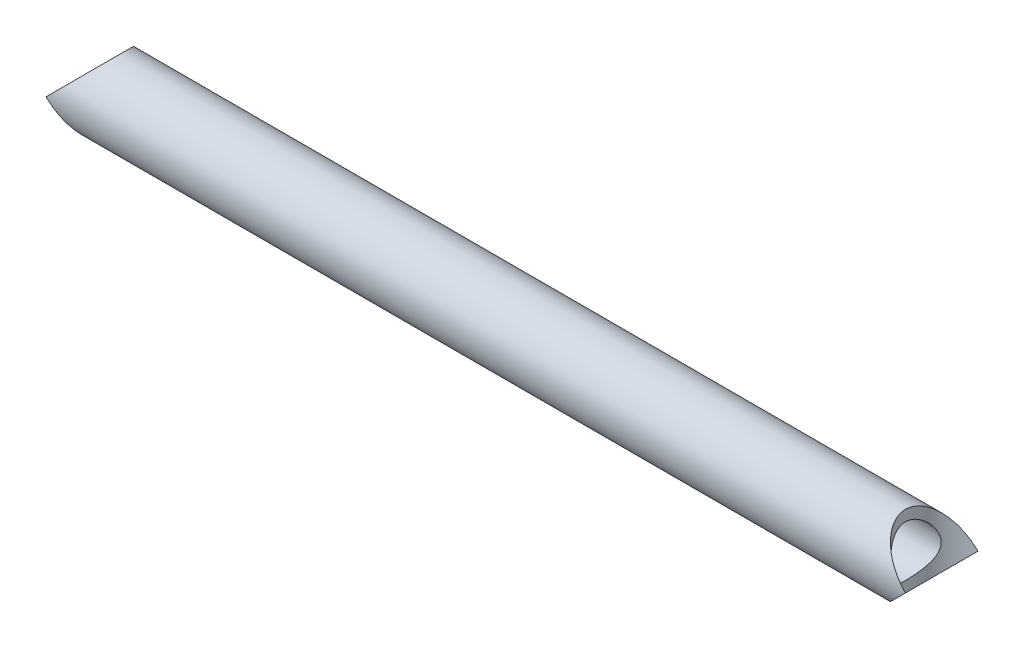
ISO-10303-21;
HEADER;
FILE_DESCRIPTION(('STEP AP214'),'2;1');
FILE_NAME('part.step','',(''),(''),'','','');
FILE_SCHEMA(('AUTOMOTIVE_DESIGN { 1 0 10303 214 1 1 1 1 }'));
ENDSEC;
DATA;
#1=APPLICATION_CONTEXT('core data for automotive mechanical design processes');
#2=APPLICATION_PROTOCOL_DEFINITION('international standard','automotive_design',2000,#1);
#3=PRODUCT_CONTEXT('',#1,'mechanical');
#4=PRODUCT('Part','Part','',(#3));
#5=PRODUCT_RELATED_PRODUCT_CATEGORY('part','',(#4));
#6=PRODUCT_DEFINITION_FORMATION('','',#4);
#7=PRODUCT_DEFINITION_CONTEXT('part definition',#1,'design');
#8=PRODUCT_DEFINITION('design','',#6,#7);
#9=PRODUCT_DEFINITION_SHAPE('','',#8);
#10=(LENGTH_UNIT() NAMED_UNIT(*) SI_UNIT(.MILLI.,.METRE.));
#11=(NAMED_UNIT(*) PLANE_ANGLE_UNIT() SI_UNIT($,.RADIAN.));
#12=(NAMED_UNIT(*) SI_UNIT($,.STERADIAN.) SOLID_ANGLE_UNIT());
#13=UNCERTAINTY_MEASURE_WITH_UNIT(LENGTH_MEASURE(1.E-05),#10,'distance_accuracy_value','');
#14=(GEOMETRIC_REPRESENTATION_CONTEXT(3) GLOBAL_UNCERTAINTY_ASSIGNED_CONTEXT((#13)) GLOBAL_UNIT_ASSIGNED_CONTEXT((#10,
#11,#12)) REPRESENTATION_CONTEXT('',''));
#15=CARTESIAN_POINT('',(0.,0.,0.));
#16=DIRECTION('',(0.,0.,1.));
#17=DIRECTION('',(1.,0.,0.));
#18=AXIS2_PLACEMENT_3D('',#15,#16,#17);
#19=CARTESIAN_POINT('',(0.,0.,0.));
#20=DIRECTION('',(1.,0.,0.));
#21=DIRECTION('',(0.,0.,-1.));
#22=AXIS2_PLACEMENT_3D('',#19,#20,#21);
#23=CYLINDRICAL_SURFACE('',#22,35.);
#24=CARTESIAN_POINT('',(35.7071421427142,0.,-35.));
#25=CARTESIAN_POINT('',(35.7071506960339,0.840107969640403,-34.999995372535));
#26=CARTESIAN_POINT('',(35.7369348035131,1.68027595587627,-34.9696838888615));
#27=CARTESIAN_POINT('',(35.8544471947958,3.35221612686096,-34.8491819248762));
#28=CARTESIAN_POINT('',(35.9421828399308,4.1839872313608,-34.7589838374224));
#29=CARTESIAN_POINT('',(36.1712293688525,5.83320919168844,-34.5205642195381));
#30=CARTESIAN_POINT('',(36.3126425511041,6.65062956617838,-34.3722318793915));
#31=CARTESIAN_POINT('',(36.6423988735656,8.26372825663241,-34.0204719036504));
#32=CARTESIAN_POINT('',(36.8307439251374,9.0594056856216,-33.8170420241069));
#33=CARTESIAN_POINT('',(37.2443889590487,10.6160962668867,-33.3608911380292));
#34=CARTESIAN_POINT('',(37.4692473366944,11.377399510945,-33.1087530503742));
#35=CARTESIAN_POINT('',(37.9498912115004,12.8722697515329,-32.5567138302996));
#36=CARTESIAN_POINT('',(38.2056760937748,13.6058372991278,-32.2568136474564));
#37=CARTESIAN_POINT('',(38.7410119421266,15.0436443658859,-31.6118578615202));
#38=CARTESIAN_POINT('',(39.020559923923,15.7478875512387,-31.2668079256177));
#39=CARTESIAN_POINT('',(39.5969082877492,17.1262102767459,-30.5336264742114));
#40=CARTESIAN_POINT('',(39.8937099050371,17.8002876510772,-30.1454918722869));
#41=CARTESIAN_POINT('',(40.551609749269,19.2329409336998,-29.2561784374031));
#42=CARTESIAN_POINT('',(40.914864074247,19.985636533046,-28.7471070972688));
#43=CARTESIAN_POINT('',(41.6482789820097,21.4471112794062,-27.6738766652288));
#44=CARTESIAN_POINT('',(42.0184400774716,22.1558871493288,-27.1097134706892));
#45=CARTESIAN_POINT('',(42.7582340933028,23.5287326231606,-25.9272125065644));
#46=CARTESIAN_POINT('',(43.127865884777,24.1927488103879,-25.3088119653039));
#47=CARTESIAN_POINT('',(43.8588504301021,25.4730222520025,-24.0197921583749));
#48=CARTESIAN_POINT('',(44.2202026109753,26.0892762080667,-23.3491692927814));
#49=CARTESIAN_POINT('',(44.9867285846432,27.3698937944522,-21.8408769297574));
#50=CARTESIAN_POINT('',(45.389154931207,28.0251298541144,-20.9940046961307));
#51=CARTESIAN_POINT('',(46.1625833914162,29.261175575932,-19.2338365369213));
#52=CARTESIAN_POINT('',(46.5335797092928,29.8419715212443,-18.3205284178719));
#53=CARTESIAN_POINT('',(47.2331338246412,30.9214761037239,-16.432938159996));
#54=CARTESIAN_POINT('',(47.561759750431,31.4203168818842,-15.4587577411312));
#55=CARTESIAN_POINT('',(48.0156533510476,32.1018921667805,-13.9560498011597));
#56=CARTESIAN_POINT('',(48.1604408743064,32.3179655365879,-13.4482527308478));
#57=CARTESIAN_POINT('',(48.4358774539447,32.7270090161536,-12.4197059332497));
#58=CARTESIAN_POINT('',(48.5665277966041,32.9199812279547,-11.8989573896723));
#59=CARTESIAN_POINT('',(48.8692939322469,33.36533512942,-10.6026563492037));
#60=CARTESIAN_POINT('',(49.0327544374962,33.6040865614514,-9.82032326239985));
#61=CARTESIAN_POINT('',(49.3238132945429,34.0273736921218,-8.23474760358175));
#62=CARTESIAN_POINT('',(49.4514179853557,34.2119189742274,-7.43150875500591));
#63=CARTESIAN_POINT('',(49.6680897633444,34.5243655933765,-5.80945738690225));
#64=CARTESIAN_POINT('',(49.7571815736647,34.6523032706249,-4.99065521170869));
#65=CARTESIAN_POINT('',(49.8949954169263,34.8499008596341,-3.3426287169344));
#66=CARTESIAN_POINT('',(49.9437160792339,34.9195587927502,-2.51340404447149));
#67=CARTESIAN_POINT('',(49.9997369695583,34.9996360491842,-0.849064569498375));
#68=CARTESIAN_POINT('',(50.0069561404409,35.0099394464219,-0.0139414278536153));
#69=CARTESIAN_POINT('',(49.9795905662272,34.9708402171738,1.65420898993208));
#70=CARTESIAN_POINT('',(49.9450059780367,34.9214378147871,2.48723627392784));
#71=CARTESIAN_POINT('',(49.8348110399218,34.7636530151837,4.14511747217352));
#72=CARTESIAN_POINT('',(49.7591911431662,34.6552568931089,4.96996943895306));
#73=CARTESIAN_POINT('',(49.5686015156259,34.3810407659299,6.60541848255173));
#74=CARTESIAN_POINT('',(49.4536317547529,34.2152207169174,7.41601554847058));
#75=CARTESIAN_POINT('',(49.1898587017827,33.8328374554661,8.99928619345004));
#76=CARTESIAN_POINT('',(49.0418920994671,33.6175256222774,9.77240316665133));
#77=CARTESIAN_POINT('',(48.7135826943793,33.1367465419105,11.2957516606701));
#78=CARTESIAN_POINT('',(48.5332406093663,32.8712804066381,12.0459836884118));
#79=CARTESIAN_POINT('',(48.1434050941599,32.2929262141351,13.5201301256891));
#80=CARTESIAN_POINT('',(47.9339096891927,31.9800349443149,14.2440427482201));
#81=CARTESIAN_POINT('',(47.4892792776534,31.3096561009199,15.6627291841093));
#82=CARTESIAN_POINT('',(47.2541427471497,30.9521658765087,16.357501262153));
#83=CARTESIAN_POINT('',(46.7342706947119,30.1528495944223,17.7919451807377));
#84=CARTESIAN_POINT('',(46.4469302640876,29.706061440908,18.5279083304046));
#85=CARTESIAN_POINT('',(45.8502583157375,28.7641961243084,19.9588293889626));
#86=CARTESIAN_POINT('',(45.5409254056233,28.2691159030151,20.6537846964576));
#87=CARTESIAN_POINT('',(44.905268593313,27.2332625058387,22.0016486225769));
#88=CARTESIAN_POINT('',(44.5789290915864,26.6924470851888,22.654517363894));
#89=CARTESIAN_POINT('',(43.9149486782088,25.5681155096849,23.9162202003436));
#90=CARTESIAN_POINT('',(43.5773072082628,24.9845972437003,24.525052115434));
#91=CARTESIAN_POINT('',(42.835453936168,23.6690082982129,25.8023689370088));
#92=CARTESIAN_POINT('',(42.4301260058014,22.92902281227,26.4620778543904));
#93=CARTESIAN_POINT('',(41.6212145950747,21.3950999291498,27.7169969188899));
#94=CARTESIAN_POINT('',(41.2176314814372,20.6011517256226,28.3121940848647));
#95=CARTESIAN_POINT('',(40.4229970554186,18.9613586582519,29.43560043687));
#96=CARTESIAN_POINT('',(40.0319444300682,18.1155192589181,29.9638166585617));
#97=CARTESIAN_POINT('',(39.274391070172,16.373534809267,30.9500992369552));
#98=CARTESIAN_POINT('',(38.9078831878682,15.4774045452744,31.4081860666885));
#99=CARTESIAN_POINT('',(38.2935106806577,13.8499610572788,32.1524984022248));
#100=CARTESIAN_POINT('',(38.0378273201614,13.1285437735056,32.4539558035031));
#101=CARTESIAN_POINT('',(37.5558036344604,11.658489952514,33.0105609907163));
#102=CARTESIAN_POINT('',(37.3294600136631,10.9098564844763,33.2657139790946));
#103=CARTESIAN_POINT('',(36.913619808298,9.38878642354701,33.7265624284367));
#104=CARTESIAN_POINT('',(36.7240655804419,8.61638930124983,33.9323353818856));
#105=CARTESIAN_POINT('',(36.3884746528101,7.05024847858442,34.2919745133211));
#106=CARTESIAN_POINT('',(36.2424374542712,6.25650502298735,34.4458412862246));
#107=CARTESIAN_POINT('',(35.9990014609517,4.64420789567828,34.7001963111161));
#108=CARTESIAN_POINT('',(35.9021245730269,3.82548200533228,34.8001124863692));
#109=CARTESIAN_POINT('',(35.7986174570841,2.59037712675722,34.9064627321118));
#110=CARTESIAN_POINT('',(35.7710820185749,2.17743677544965,34.9346598809064));
#111=CARTESIAN_POINT('',(35.7302726607355,1.35012910288847,34.9763998951334));
#112=CARTESIAN_POINT('',(35.7169969035873,0.935761972428675,34.9899446489994));
#113=CARTESIAN_POINT('',(35.7048954563494,0.106691028185822,35.0022927186814));
#114=CARTESIAN_POINT('',(35.7060667644854,-0.308012697754987,35.0010990967995));
#115=CARTESIAN_POINT('',(35.7228314393242,-1.13680514686352,34.9839886104874));
#116=CARTESIAN_POINT('',(35.7384241537951,-1.55089389699623,34.9680724119102));
#117=CARTESIAN_POINT('',(35.7838226288508,-2.3774371534342,34.9216136308916));
#118=CARTESIAN_POINT('',(35.8136272747461,-2.78989178535105,34.8910721955558));
#119=CARTESIAN_POINT('',(35.8870522222923,-3.61225163317412,34.8155455653265));
#120=CARTESIAN_POINT('',(35.9306737746918,-4.02215661485162,34.7705590628161));
#121=CARTESIAN_POINT('',(36.0674353440016,-5.13275958039296,34.628830086058));
#122=CARTESIAN_POINT('',(36.1736069266568,-5.83014671179401,34.5181524617777));
#123=CARTESIAN_POINT('',(36.4216177149305,-7.21081339858577,34.2563585102615));
#124=CARTESIAN_POINT('',(36.5634600998927,-7.89409169057616,34.1052385783199));
#125=CARTESIAN_POINT('',(36.7996706714261,-8.90638582719782,33.8496330627377));
#126=CARTESIAN_POINT('',(36.8823645332531,-9.24188471101654,33.7595558421607));
#127=CARTESIAN_POINT('',(37.0549594724068,-9.90825578804266,33.5700224936967));
#128=CARTESIAN_POINT('',(37.1448587128163,-10.2391291353681,33.4705687550979));
#129=CARTESIAN_POINT('',(37.4245511873983,-11.2247039209303,33.1584238688599));
#130=CARTESIAN_POINT('',(37.6243163755767,-11.8722636876034,32.9319734954838));
#131=CARTESIAN_POINT('',(38.1450116429683,-13.4471289901202,32.3292847026574));
#132=CARTESIAN_POINT('',(38.4786826354399,-14.3624821169311,31.9327431276927));
#133=CARTESIAN_POINT('',(39.17935195492,-16.1460468025932,31.0690795732735));
#134=CARTESIAN_POINT('',(39.5463636510368,-17.0142392257618,30.6019292305053));
#135=CARTESIAN_POINT('',(40.301755140756,-18.7030125712252,29.6000468705433));
#136=CARTESIAN_POINT('',(40.6901690992031,-19.5235128045581,29.0652049211536));
#137=CARTESIAN_POINT('',(41.4766613548323,-21.1137610555909,27.9313912336668));
#138=CARTESIAN_POINT('',(41.8747385293508,-21.8835149307104,27.3324269179354));
#139=CARTESIAN_POINT('',(42.6782094469072,-23.3845880727686,26.0604489027733));
#140=CARTESIAN_POINT('',(43.0835991051203,-24.1149044709452,25.3862484916673));
#141=CARTESIAN_POINT('',(43.8845241661419,-25.5182947538454,23.9751284614132));
#142=CARTESIAN_POINT('',(44.2800588422473,-26.1913644259963,23.2382042346232));
#143=CARTESIAN_POINT('',(45.0516121398882,-27.4756407183392,21.7045656028507));
#144=CARTESIAN_POINT('',(45.4276553690046,-28.0869263146648,20.9079298540213));
#145=CARTESIAN_POINT('',(46.1519228719792,-29.2438607968108,19.2564928275713));
#146=CARTESIAN_POINT('',(46.5001524117578,-29.7895221171094,18.4017026172605));
#147=CARTESIAN_POINT('',(47.1070354510041,-30.7274970425655,16.7795041914442));
#148=CARTESIAN_POINT('',(47.3710826196034,-31.130353940521,16.0201979371559));
#149=CARTESIAN_POINT('',(47.8686375255639,-31.8823772598025,14.4657940381274));
#150=CARTESIAN_POINT('',(48.1021481674375,-32.2315487880222,13.6706998070806));
#151=CARTESIAN_POINT('',(48.5338342134184,-32.8723150806321,12.0486880086856));
#152=CARTESIAN_POINT('',(48.7320243632472,-33.1639338778232,11.2217838975692));
#153=CARTESIAN_POINT('',(49.0888678981733,-33.686099501524,9.54051455852408));
#154=CARTESIAN_POINT('',(49.2475209407915,-33.9166457990113,8.68614909279145));
#155=CARTESIAN_POINT('',(49.5223628402394,-34.3145050274897,6.95066907682188));
#156=CARTESIAN_POINT('',(49.6382983456405,-34.4814408876361,6.06942746964133));
#157=CARTESIAN_POINT('',(49.8234712104536,-34.747480837529,4.29186573010808));
#158=CARTESIAN_POINT('',(49.89270839869,-34.8465846786329,3.39554554249624));
#159=CARTESIAN_POINT('',(49.9826479611912,-34.9752371825238,1.59576611558513));
#160=CARTESIAN_POINT('',(50.0033653249028,-35.0048073266787,0.692309167644005));
#161=CARTESIAN_POINT('',(49.9957458354449,-34.9939228964912,-1.11393360341865));
#162=CARTESIAN_POINT('',(49.967412667374,-34.9534735826137,-2.01671947185972));
#163=CARTESIAN_POINT('',(49.8675605979219,-34.8105711222887,-3.72659142724014));
#164=CARTESIAN_POINT('',(49.8004867088333,-34.7144977394336,-4.53448332214181));
#165=CARTESIAN_POINT('',(49.6284147166179,-34.4671937596204,-6.13760931900885));
#166=CARTESIAN_POINT('',(49.5234195177799,-34.3159673866695,-6.93284438545749));
#167=CARTESIAN_POINT('',(49.2776451215939,-33.9603123439271,-8.5057315286114));
#168=CARTESIAN_POINT('',(49.1368618620034,-33.755877634484,-9.28338159835413));
#169=CARTESIAN_POINT('',(48.8222529665738,-33.2962526672194,-10.8166637252959));
#170=CARTESIAN_POINT('',(48.6484257074945,-33.0410599159517,-11.5722946987338));
#171=CARTESIAN_POINT('',(48.2643074446274,-32.4728920278149,-13.0837972709848));
#172=CARTESIAN_POINT('',(48.052955251691,-32.1582105745043,-13.8387561939889));
#173=CARTESIAN_POINT('',(47.6021025925178,-31.4805362011754,-15.3178881400829));
#174=CARTESIAN_POINT('',(47.3626018142448,-31.117542745597,-16.042060821776));
#175=CARTESIAN_POINT('',(46.8595068054807,-30.3463145406757,-17.4571070426294));
#176=CARTESIAN_POINT('',(46.5959122060687,-29.938079098574,-18.1479800716629));
#177=CARTESIAN_POINT('',(46.0487444192928,-29.0791421274552,-19.4946500007173));
#178=CARTESIAN_POINT('',(45.7651687920868,-28.6284354100837,-20.1504425998801));
#179=CARTESIAN_POINT('',(45.305274720761,-27.8857225328781,-21.1564757921154));
#180=CARTESIAN_POINT('',(45.1341490192931,-27.6069328443119,-21.5189576356897));
#181=CARTESIAN_POINT('',(44.7875261838629,-27.0365267034799,-22.2313832619618));
#182=CARTESIAN_POINT('',(44.6120299247389,-26.744912809379,-22.5813295202048));
#183=CARTESIAN_POINT('',(44.0801378688905,-25.8512679541399,-23.6122700447218));
#184=CARTESIAN_POINT('',(43.7183422111443,-25.2304393012965,-24.2743586500883));
#185=CARTESIAN_POINT('',(42.986717528521,-23.9403587995707,-25.5476507252639));
#186=CARTESIAN_POINT('',(42.6168739385289,-23.2710129671869,-26.1587502186705));
#187=CARTESIAN_POINT('',(41.8771679212079,-21.8869665025461,-27.3272936639212));
#188=CARTESIAN_POINT('',(41.5073054939074,-21.1722634957601,-27.8847348028034));
#189=CARTESIAN_POINT('',(40.7178655377321,-19.5829695599545,-29.0277545461194));
#190=CARTESIAN_POINT('',(40.2996303035014,-18.7009229658389,-29.6039422453109));
#191=CARTESIAN_POINT('',(39.4874687483406,-16.8797062451459,-30.6788813859251));
#192=CARTESIAN_POINT('',(39.0935492998776,-15.9405201165736,-31.177610994896));
#193=CARTESIAN_POINT('',(38.3468520577183,-14.00970137275,-32.0915302946143));
#194=CARTESIAN_POINT('',(37.9939747623268,-13.0182044454697,-32.5069238759459));
#195=CARTESIAN_POINT('',(37.3461510738313,-10.9845988078023,-33.2491818357296));
#196=CARTESIAN_POINT('',(37.0511647388101,-9.94252561611601,-33.5761073122506));
#197=CARTESIAN_POINT('',(36.6226388034773,-8.16673687167302,-34.0418372383946));
#198=CARTESIAN_POINT('',(36.4679655418352,-7.44496965137639,-34.2071029882412));
#199=CARTESIAN_POINT('',(36.1981999556148,-5.98528009630567,-34.4924486251216));
#200=CARTESIAN_POINT('',(36.0830992907113,-5.24736120057574,-34.6125380340294));
#201=CARTESIAN_POINT('',(35.897105098182,-3.76095860921782,-34.80540039525));
#202=CARTESIAN_POINT('',(35.8261438552186,-3.01249290688711,-34.878245833023));
#203=CARTESIAN_POINT('',(35.7311564440406,-1.5093679786863,-34.9755498701451));
#204=CARTESIAN_POINT('',(35.7071344588679,-0.754708206842459,-35.0000041570678));
#205=CARTESIAN_POINT('',(35.7071421427142,0.,-35.));
#206=B_SPLINE_CURVE_WITH_KNOTS('',3,(#24,#25,#26,#27,#28,#29,#30,#31,#32,#33,#34,#35,#36,#37,
#38,#39,#40,#41,#42,#43,#44,#45,#46,#47,#48,#49,#50,#51,#52,#53,#54,#55,#56,#57,#58,#59,#60,#61,
#62,#63,#64,#65,#66,#67,#68,#69,#70,#71,#72,#73,#74,#75,#76,#77,#78,#79,#80,#81,#82,#83,#84,#85,
#86,#87,#88,#89,#90,#91,#92,#93,#94,#95,#96,#97,#98,#99,#100,#101,#102,#103,#104,#105,#106,#107,
#108,#109,#110,#111,#112,#113,#114,#115,#116,#117,#118,#119,#120,#121,#122,#123,#124,#125,#126,
#127,#128,#129,#130,#131,#132,#133,#134,#135,#136,#137,#138,#139,#140,#141,#142,#143,#144,#145,
#146,#147,#148,#149,#150,#151,#152,#153,#154,#155,#156,#157,#158,#159,#160,#161,#162,#163,#164,
#165,#166,#167,#168,#169,#170,#171,#172,#173,#174,#175,#176,#177,#178,#179,#180,#181,#182,#183,
#184,#185,#186,#187,#188,#189,#190,#191,#192,#193,#194,#195,#196,#197,#198,#199,#200,#201,#202,
#203,#204,#205),.UNSPECIFIED.,.T.,.F.,(4,2,2,2,2,2,2,2,2,2,2,2,2,2,2,2,2,2,2,2,2,2,2,2,2,2,2,2,
2,2,2,2,2,2,2,2,2,2,2,2,2,2,2,2,2,2,2,2,2,2,2,2,2,2,2,2,2,2,2,2,2,2,2,2,2,2,2,2,2,2,2,2,2,2,2,2,
2,2,2,2,2,2,2,2,2,2,2,2,2,2,4),(0.,2.51937866427342,5.03907741580433,7.56360250876945,
10.0882304331426,12.5843322553073,15.0803844577134,17.5761236560116,20.0720417550408,
23.0051397161625,25.9384562688945,28.8752136656239,31.8121736860625,35.2391435548816,
38.6667439954376,42.0887624993612,43.7996953865138,45.5104724722832,48.0100243114239,
50.5091339717734,53.0066369505803,55.5042247182006,58.0066889059335,60.5091437009683,
63.0121809398334,65.5152200926113,67.9608365527419,70.4063988006499,72.8521267856099,
75.2980002070769,78.0183021621446,80.738776498668,83.4617917237844,86.1849416595811,
89.3946103526887,92.6049237053712,95.8148995677452,99.0239365403022,101.48975503957,
103.955296324787,106.416942736103,108.878560932582,111.365792918491,112.60982351497,
113.853693758897,115.097305559003,116.340861117453,117.584319155706,118.827889787785,
120.967607439389,123.107515871967,124.178586002065,125.249383940071,127.391285251522,
130.542393968124,133.694771855559,136.852336572213,140.009536185203,143.226476554708,
146.443653442402,149.656664501507,152.869065797363,155.564040644996,158.258758970658,
160.952349647025,163.645963655054,166.355305307157,169.064656890469,171.773171351185,
174.48148233379,176.927676405827,179.373683170305,181.819967700969,184.266372433007,
186.798189652957,189.330034941575,191.861919003928,194.394112766985,195.85858426996,
197.322764954496,200.251155740817,203.185379115735,206.119756229405,209.516188906609,
212.913577176739,216.302549186755,219.689174688125,221.956212393578,224.222772004585,
226.485845800691,228.749121263825),.UNSPECIFIED.);
#207=CARTESIAN_POINT('',(35.7071421427142,0.,-35.));
#208=VERTEX_POINT('',#207);
#209=EDGE_CURVE('E37',#208,#208,#206,.T.);
#210=ORIENTED_EDGE('',*,*,#209,.F.);
#211=EDGE_LOOP('',(#210));
#212=FACE_BOUND('',#211,.T.);
#213=CARTESIAN_POINT('',(1149.05285785729,0.,-35.));
#214=CARTESIAN_POINT('',(1149.05284930397,-0.840107969640396,-34.999995372535));
#215=CARTESIAN_POINT('',(1149.02306519649,-1.68027595587626,-34.9696838888615));
#216=CARTESIAN_POINT('',(1148.9055528052,-3.35221612686095,-34.8491819248762));
#217=CARTESIAN_POINT('',(1148.81781716007,-4.18398723136077,-34.7589838374224));
#218=CARTESIAN_POINT('',(1148.58877063115,-5.83320919168842,-34.5205642195381));
#219=CARTESIAN_POINT('',(1148.4473574489,-6.65062956617838,-34.3722318793915));
#220=CARTESIAN_POINT('',(1148.11760112643,-8.26372825663241,-34.0204719036504));
#221=CARTESIAN_POINT('',(1147.92925607486,-9.05940568562159,-33.8170420241069));
#222=CARTESIAN_POINT('',(1147.51561104095,-10.6160962668866,-33.3608911380292));
#223=CARTESIAN_POINT('',(1147.29075266331,-11.377399510945,-33.1087530503742));
#224=CARTESIAN_POINT('',(1146.8101087885,-12.8722697515329,-32.5567138302996));
#225=CARTESIAN_POINT('',(1146.55432390623,-13.6058372991277,-32.2568136474564));
#226=CARTESIAN_POINT('',(1146.01898805787,-15.0436443658859,-31.6118578615202));
#227=CARTESIAN_POINT('',(1145.73944007608,-15.7478875512386,-31.2668079256177));
#228=CARTESIAN_POINT('',(1145.16309171225,-17.1262102767458,-30.5336264742114));
#229=CARTESIAN_POINT('',(1144.86629009496,-17.8002876510772,-30.1454918722869));
#230=CARTESIAN_POINT('',(1144.20839025073,-19.2329409336998,-29.2561784374031));
#231=CARTESIAN_POINT('',(1143.84513592575,-19.985636533046,-28.7471070972688));
#232=CARTESIAN_POINT('',(1143.11172101799,-21.4471112794062,-27.6738766652288));
#233=CARTESIAN_POINT('',(1142.74155992253,-22.1558871493287,-27.1097134706892));
#234=CARTESIAN_POINT('',(1142.0017659067,-23.5287326231605,-25.9272125065645));
#235=CARTESIAN_POINT('',(1141.63213411522,-24.1927488103878,-25.308811965304));
#236=CARTESIAN_POINT('',(1140.9011495699,-25.4730222520025,-24.0197921583749));
#237=CARTESIAN_POINT('',(1140.53979738902,-26.0892762080667,-23.3491692927814));
#238=CARTESIAN_POINT('',(1139.77327141536,-27.3698937944522,-21.8408769297575));
#239=CARTESIAN_POINT('',(1139.37084506879,-28.0251298541144,-20.9940046961308));
#240=CARTESIAN_POINT('',(1138.59741660858,-29.2611755759319,-19.2338365369213));
#241=CARTESIAN_POINT('',(1138.22642029071,-29.8419715212443,-18.320528417872));
#242=CARTESIAN_POINT('',(1137.52686617536,-30.9214761037239,-16.432938159996));
#243=CARTESIAN_POINT('',(1137.19824024957,-31.4203168818842,-15.4587577411312));
#244=CARTESIAN_POINT('',(1136.74434664895,-32.1018921667805,-13.9560498011597));
#245=CARTESIAN_POINT('',(1136.59955912569,-32.317965536588,-13.4482527308478));
#246=CARTESIAN_POINT('',(1136.32412254606,-32.7270090161536,-12.4197059332496));
#247=CARTESIAN_POINT('',(1136.1934722034,-32.9199812279547,-11.8989573896723));
#248=CARTESIAN_POINT('',(1135.89070606775,-33.36533512942,-10.6026563492037));
#249=CARTESIAN_POINT('',(1135.7272455625,-33.6040865614514,-9.82032326239982));
#250=CARTESIAN_POINT('',(1135.43618670546,-34.0273736921218,-8.23474760358171));
#251=CARTESIAN_POINT('',(1135.30858201464,-34.2119189742274,-7.43150875500587));
#252=CARTESIAN_POINT('',(1135.09191023666,-34.5243655933765,-5.80945738690222));
#253=CARTESIAN_POINT('',(1135.00281842634,-34.6523032706249,-4.99065521170866));
#254=CARTESIAN_POINT('',(1134.86500458307,-34.8499008596341,-3.34262871693438));
#255=CARTESIAN_POINT('',(1134.81628392077,-34.9195587927502,-2.51340404447147));
#256=CARTESIAN_POINT('',(1134.76026303044,-34.9996360491842,-0.849064569498356));
#257=CARTESIAN_POINT('',(1134.75304385956,-35.0099394464219,-0.0139414278536016));
#258=CARTESIAN_POINT('',(1134.78040943377,-34.9708402171738,1.6542089899321));
#259=CARTESIAN_POINT('',(1134.81499402196,-34.9214378147871,2.48723627392785));
#260=CARTESIAN_POINT('',(1134.92518896008,-34.7636530151837,4.14511747217353));
#261=CARTESIAN_POINT('',(1135.00080885683,-34.6552568931089,4.96996943895305));
#262=CARTESIAN_POINT('',(1135.19139848437,-34.3810407659299,6.60541848255172));
#263=CARTESIAN_POINT('',(1135.30636824525,-34.2152207169174,7.41601554847059));
#264=CARTESIAN_POINT('',(1135.57014129822,-33.8328374554661,8.99928619345004));
#265=CARTESIAN_POINT('',(1135.71810790053,-33.6175256222774,9.7724031666513));
#266=CARTESIAN_POINT('',(1136.04641730562,-33.1367465419105,11.29575166067));
#267=CARTESIAN_POINT('',(1136.22675939063,-32.8712804066381,12.0459836884117));
#268=CARTESIAN_POINT('',(1136.61659490584,-32.2929262141351,13.520130125689));
#269=CARTESIAN_POINT('',(1136.82609031081,-31.9800349443149,14.24404274822));
#270=CARTESIAN_POINT('',(1137.27072072235,-31.3096561009199,15.6627291841092));
#271=CARTESIAN_POINT('',(1137.50585725285,-30.9521658765087,16.3575012621529));
#272=CARTESIAN_POINT('',(1138.02572930529,-30.1528495944223,17.7919451807377));
#273=CARTESIAN_POINT('',(1138.31306973591,-29.7060614409079,18.5279083304047));
#274=CARTESIAN_POINT('',(1138.90974168426,-28.7641961243083,19.9588293889626));
#275=CARTESIAN_POINT('',(1139.21907459438,-28.2691159030151,20.6537846964576));
#276=CARTESIAN_POINT('',(1139.85473140669,-27.2332625058387,22.0016486225769));
#277=CARTESIAN_POINT('',(1140.18107090841,-26.6924470851887,22.654517363894));
#278=CARTESIAN_POINT('',(1140.84505132179,-25.5681155096848,23.9162202003437));
#279=CARTESIAN_POINT('',(1141.18269279174,-24.9845972437002,24.525052115434));
#280=CARTESIAN_POINT('',(1141.92454606383,-23.6690082982129,25.8023689370088));
#281=CARTESIAN_POINT('',(1142.3298739942,-22.9290228122699,26.4620778543905));
#282=CARTESIAN_POINT('',(1143.13878540493,-21.3950999291497,27.71699691889));
#283=CARTESIAN_POINT('',(1143.54236851856,-20.6011517256225,28.3121940848647));
#284=CARTESIAN_POINT('',(1144.33700294458,-18.9613586582518,29.43560043687));
#285=CARTESIAN_POINT('',(1144.72805556993,-18.1155192589181,29.9638166585617));
#286=CARTESIAN_POINT('',(1145.48560892983,-16.373534809267,30.9500992369552));
#287=CARTESIAN_POINT('',(1145.85211681213,-15.4774045452744,31.4081860666885));
#288=CARTESIAN_POINT('',(1146.46648931934,-13.8499610572789,32.1524984022248));
#289=CARTESIAN_POINT('',(1146.72217267984,-13.1285437735057,32.4539558035031));
#290=CARTESIAN_POINT('',(1147.20419636554,-11.658489952514,33.0105609907163));
#291=CARTESIAN_POINT('',(1147.43053998634,-10.9098564844763,33.2657139790946));
#292=CARTESIAN_POINT('',(1147.8463801917,-9.38878642354702,33.7265624284367));
#293=CARTESIAN_POINT('',(1148.03593441956,-8.61638930124984,33.9323353818856));
#294=CARTESIAN_POINT('',(1148.37152534719,-7.05024847858444,34.2919745133211));
#295=CARTESIAN_POINT('',(1148.51756254573,-6.25650502298736,34.4458412862246));
#296=CARTESIAN_POINT('',(1148.76099853905,-4.64420789567829,34.7001963111161));
#297=CARTESIAN_POINT('',(1148.85787542697,-3.82548200533229,34.8001124863692));
#298=CARTESIAN_POINT('',(1148.96138254292,-2.59037712675723,34.9064627321118));
#299=CARTESIAN_POINT('',(1148.98891798143,-2.17743677544966,34.9346598809064));
#300=CARTESIAN_POINT('',(1149.02972733926,-1.35012910288847,34.9763998951334));
#301=CARTESIAN_POINT('',(1149.04300309641,-0.935761972428679,34.9899446489994));
#302=CARTESIAN_POINT('',(1149.05510454365,-0.10669102818582,35.0022927186814));
#303=CARTESIAN_POINT('',(1149.05393323551,0.308012697754991,35.0010990967995));
#304=CARTESIAN_POINT('',(1149.03716856068,1.13680514686352,34.9839886104874));
#305=CARTESIAN_POINT('',(1149.0215758462,1.55089389699623,34.9680724119102));
#306=CARTESIAN_POINT('',(1148.97617737115,2.37743715343419,34.9216136308916));
#307=CARTESIAN_POINT('',(1148.94637272525,2.78989178535105,34.8910721955558));
#308=CARTESIAN_POINT('',(1148.87294777771,3.61225163317412,34.8155455653265));
#309=CARTESIAN_POINT('',(1148.82932622531,4.02215661485162,34.7705590628161));
#310=CARTESIAN_POINT('',(1148.692564656,5.13275958039296,34.628830086058));
#311=CARTESIAN_POINT('',(1148.58639307334,5.83014671179402,34.5181524617777));
#312=CARTESIAN_POINT('',(1148.33838228507,7.21081339858576,34.2563585102615));
#313=CARTESIAN_POINT('',(1148.19653990011,7.89409169057615,34.1052385783199));
#314=CARTESIAN_POINT('',(1147.96032932857,8.90638582719782,33.8496330627377));
#315=CARTESIAN_POINT('',(1147.87763546675,9.24188471101656,33.7595558421607));
#316=CARTESIAN_POINT('',(1147.70504052759,9.9082557880427,33.5700224936967));
#317=CARTESIAN_POINT('',(1147.61514128718,10.2391291353681,33.4705687550979));
#318=CARTESIAN_POINT('',(1147.3354488126,11.2247039209303,33.1584238688599));
#319=CARTESIAN_POINT('',(1147.13568362442,11.8722636876034,32.9319734954838));
#320=CARTESIAN_POINT('',(1146.61498835703,13.4471289901202,32.3292847026574));
#321=CARTESIAN_POINT('',(1146.28131736456,14.3624821169311,31.9327431276927));
#322=CARTESIAN_POINT('',(1145.58064804508,16.1460468025932,31.0690795732735));
#323=CARTESIAN_POINT('',(1145.21363634896,17.0142392257618,30.6019292305053));
#324=CARTESIAN_POINT('',(1144.45824485924,18.7030125712252,29.6000468705433));
#325=CARTESIAN_POINT('',(1144.0698309008,19.5235128045581,29.0652049211536));
#326=CARTESIAN_POINT('',(1143.28333864517,21.1137610555909,27.9313912336668));
#327=CARTESIAN_POINT('',(1142.88526147065,21.8835149307104,27.3324269179354));
#328=CARTESIAN_POINT('',(1142.08179055309,23.3845880727686,26.0604489027733));
#329=CARTESIAN_POINT('',(1141.67640089488,24.1149044709452,25.3862484916673));
#330=CARTESIAN_POINT('',(1140.87547583386,25.5182947538454,23.9751284614132));
#331=CARTESIAN_POINT('',(1140.47994115775,26.1913644259963,23.2382042346231));
#332=CARTESIAN_POINT('',(1139.70838786011,27.4756407183393,21.7045656028507));
#333=CARTESIAN_POINT('',(1139.332344631,28.0869263146648,20.9079298540213));
#334=CARTESIAN_POINT('',(1138.60807712802,29.2438607968108,19.2564928275713));
#335=CARTESIAN_POINT('',(1138.25984758824,29.7895221171094,18.4017026172605));
#336=CARTESIAN_POINT('',(1137.652964549,30.7274970425655,16.7795041914442));
#337=CARTESIAN_POINT('',(1137.3889173804,31.130353940521,16.0201979371559));
#338=CARTESIAN_POINT('',(1136.89136247444,31.8823772598025,14.4657940381274));
#339=CARTESIAN_POINT('',(1136.65785183256,32.2315487880222,13.6706998070806));
#340=CARTESIAN_POINT('',(1136.22616578658,32.8723150806322,12.0486880086856));
#341=CARTESIAN_POINT('',(1136.02797563675,33.1639338778232,11.2217838975692));
#342=CARTESIAN_POINT('',(1135.67113210183,33.686099501524,9.54051455852405));
#343=CARTESIAN_POINT('',(1135.51247905921,33.9166457990113,8.68614909279141));
#344=CARTESIAN_POINT('',(1135.23763715976,34.3145050274897,6.95066907682184));
#345=CARTESIAN_POINT('',(1135.12170165436,34.4814408876361,6.0694274696413));
#346=CARTESIAN_POINT('',(1134.93652878955,34.747480837529,4.29186573010806));
#347=CARTESIAN_POINT('',(1134.86729160131,34.8465846786329,3.39554554249621));
#348=CARTESIAN_POINT('',(1134.77735203881,34.9752371825238,1.59576611558508));
#349=CARTESIAN_POINT('',(1134.7566346751,35.0048073266787,0.692309167643971));
#350=CARTESIAN_POINT('',(1134.76425416456,34.9939228964912,-1.11393360341868));
#351=CARTESIAN_POINT('',(1134.79258733263,34.9534735826137,-2.01671947185976));
#352=CARTESIAN_POINT('',(1134.89243940208,34.8105711222887,-3.72659142724019));
#353=CARTESIAN_POINT('',(1134.95951329117,34.7144977394336,-4.53448332214188));
#354=CARTESIAN_POINT('',(1135.13158528338,34.4671937596204,-6.13760931900892));
#355=CARTESIAN_POINT('',(1135.23658048222,34.3159673866695,-6.93284438545755));
#356=CARTESIAN_POINT('',(1135.48235487841,33.9603123439271,-8.50573152861147));
#357=CARTESIAN_POINT('',(1135.623138138,33.755877634484,-9.28338159835421));
#358=CARTESIAN_POINT('',(1135.93774703343,33.2962526672194,-10.816663725296));
#359=CARTESIAN_POINT('',(1136.11157429251,33.0410599159517,-11.5722946987338));
#360=CARTESIAN_POINT('',(1136.49569255537,32.4728920278148,-13.0837972709849));
#361=CARTESIAN_POINT('',(1136.70704474831,32.1582105745042,-13.838756193989));
#362=CARTESIAN_POINT('',(1137.15789740748,31.4805362011754,-15.317888140083));
#363=CARTESIAN_POINT('',(1137.39739818576,31.1175427455969,-16.0420608217761));
#364=CARTESIAN_POINT('',(1137.90049319452,30.3463145406757,-17.4571070426295));
#365=CARTESIAN_POINT('',(1138.16408779393,29.938079098574,-18.1479800716629));
#366=CARTESIAN_POINT('',(1138.71125558071,29.0791421274552,-19.4946500007173));
#367=CARTESIAN_POINT('',(1138.99483120791,28.6284354100836,-20.1504425998801));
#368=CARTESIAN_POINT('',(1139.45472527924,27.885722532878,-21.1564757921155));
#369=CARTESIAN_POINT('',(1139.62585098071,27.6069328443119,-21.5189576356897));
#370=CARTESIAN_POINT('',(1139.97247381614,27.0365267034799,-22.2313832619618));
#371=CARTESIAN_POINT('',(1140.14797007526,26.744912809379,-22.5813295202048));
#372=CARTESIAN_POINT('',(1140.67986213111,25.8512679541399,-23.6122700447218));
#373=CARTESIAN_POINT('',(1141.04165778886,25.2304393012965,-24.2743586500882));
#374=CARTESIAN_POINT('',(1141.77328247148,23.9403587995708,-25.5476507252638));
#375=CARTESIAN_POINT('',(1142.14312606147,23.2710129671869,-26.1587502186705));
#376=CARTESIAN_POINT('',(1142.88283207879,21.886966502546,-27.3272936639212));
#377=CARTESIAN_POINT('',(1143.25269450609,21.17226349576,-27.8847348028034));
#378=CARTESIAN_POINT('',(1144.04213446227,19.5829695599544,-29.0277545461195));
#379=CARTESIAN_POINT('',(1144.4603696965,18.7009229658389,-29.6039422453109));
#380=CARTESIAN_POINT('',(1145.27253125166,16.8797062451459,-30.6788813859251));
#381=CARTESIAN_POINT('',(1145.66645070012,15.9405201165735,-31.1776109948961));
#382=CARTESIAN_POINT('',(1146.41314794228,14.00970137275,-32.0915302946143));
#383=CARTESIAN_POINT('',(1146.76602523767,13.0182044454697,-32.5069238759459));
#384=CARTESIAN_POINT('',(1147.41384892617,10.9845988078023,-33.2491818357296));
#385=CARTESIAN_POINT('',(1147.70883526119,9.94252561611598,-33.5761073122506));
#386=CARTESIAN_POINT('',(1148.13736119652,8.16673687167296,-34.0418372383946));
#387=CARTESIAN_POINT('',(1148.29203445816,7.44496965137633,-34.2071029882412));
#388=CARTESIAN_POINT('',(1148.56180004439,5.98528009630562,-34.4924486251216));
#389=CARTESIAN_POINT('',(1148.67690070929,5.2473612005757,-34.6125380340294));
#390=CARTESIAN_POINT('',(1148.86289490182,3.76095860921779,-34.80540039525));
#391=CARTESIAN_POINT('',(1148.93385614478,3.01249290688708,-34.878245833023));
#392=CARTESIAN_POINT('',(1149.02884355596,1.50936797868628,-34.9755498701451));
#393=CARTESIAN_POINT('',(1149.05286554113,0.75470820684245,-35.0000041570678));
#394=CARTESIAN_POINT('',(1149.05285785729,0.,-35.));
#395=B_SPLINE_CURVE_WITH_KNOTS('',3,(#213,#214,#215,#216,#217,#218,#219,#220,#221,#222,#223,
#224,#225,#226,#227,#228,#229,#230,#231,#232,#233,#234,#235,#236,#237,#238,#239,#240,#241,#242,
#243,#244,#245,#246,#247,#248,#249,#250,#251,#252,#253,#254,#255,#256,#257,#258,#259,#260,#261,
#262,#263,#264,#265,#266,#267,#268,#269,#270,#271,#272,#273,#274,#275,#276,#277,#278,#279,#280,
#281,#282,#283,#284,#285,#286,#287,#288,#289,#290,#291,#292,#293,#294,#295,#296,#297,#298,#299,
#300,#301,#302,#303,#304,#305,#306,#307,#308,#309,#310,#311,#312,#313,#314,#315,#316,#317,#318,
#319,#320,#321,#322,#323,#324,#325,#326,#327,#328,#329,#330,#331,#332,#333,#334,#335,#336,#337,
#338,#339,#340,#341,#342,#343,#344,#345,#346,#347,#348,#349,#350,#351,#352,#353,#354,#355,#356,
#357,#358,#359,#360,#361,#362,#363,#364,#365,#366,#367,#368,#369,#370,#371,#372,#373,#374,#375,
#376,#377,#378,#379,#380,#381,#382,#383,#384,#385,#386,#387,#388,#389,#390,#391,#392,#393,#394),
.UNSPECIFIED.,.T.,.F.,(4,2,2,2,2,2,2,2,2,2,2,2,2,2,2,2,2,2,2,2,2,2,2,2,2,2,2,2,2,2,2,2,2,2,2,2,
2,2,2,2,2,2,2,2,2,2,2,2,2,2,2,2,2,2,2,2,2,2,2,2,2,2,2,2,2,2,2,2,2,2,2,2,2,2,2,2,2,2,2,2,2,2,2,2,
2,2,2,2,2,2,4),(0.,2.5193786642734,5.03907741580432,7.56360250876945,10.0882304331427,
12.5843322553073,15.0803844577134,17.5761236560115,20.0720417550408,23.0051397161625,
25.9384562688945,28.8752136656238,31.8121736860625,35.2391435548815,38.6667439954376,
42.0887624993612,43.7996953865139,45.5104724722833,48.0100243114239,50.5091339717734,
53.0066369505804,55.5042247182007,58.0066889059335,60.5091437009683,63.0121809398334,
65.5152200926113,67.9608365527418,70.4063988006499,72.8521267856099,75.2980002070769,
78.0183021621446,80.7387764986681,83.4617917237845,86.1849416595811,89.3946103526888,
92.6049237053713,95.8148995677453,99.0239365403022,101.48975503957,103.955296324787,
106.416942736103,108.878560932582,111.365792918491,112.60982351497,113.853693758897,
115.097305559003,116.340861117453,117.584319155706,118.827889787785,120.967607439389,
123.107515871967,124.178586002065,125.249383940071,127.391285251522,130.542393968124,
133.694771855559,136.852336572213,140.009536185203,143.226476554708,146.443653442402,
149.656664501507,152.869065797364,155.564040644996,158.258758970658,160.952349647025,
163.645963655054,166.355305307157,169.064656890469,171.773171351185,174.48148233379,
176.927676405827,179.373683170306,181.819967700969,184.266372433007,186.798189652957,
189.330034941575,191.861919003928,194.394112766985,195.85858426996,197.322764954496,
200.251155740817,203.185379115735,206.119756229405,209.516188906609,212.913577176739,
216.302549186755,219.689174688125,221.956212393578,224.222772004585,226.485845800691,
228.749121263825),.UNSPECIFIED.);
#396=CARTESIAN_POINT('',(1149.05285785729,0.,-35.));
#397=VERTEX_POINT('',#396);
#398=EDGE_CURVE('E68',#397,#397,#395,.T.);
#399=ORIENTED_EDGE('',*,*,#398,.F.);
#400=EDGE_LOOP('',(#399));
#401=FACE_BOUND('',#400,.T.);
#402=ADVANCED_FACE('F33',(#212,#401),#23,.F.);
#403=CARTESIAN_POINT('',(1184.76,-50.,0.));
#404=DIRECTION('',(0.,1.,0.));
#405=DIRECTION('',(0.,0.,1.));
#406=AXIS2_PLACEMENT_3D('',#403,#404,#405);
#407=CYLINDRICAL_SURFACE('',#406,50.);
#408=CARTESIAN_POINT('',(1184.76,0.,0.));
#409=DIRECTION('',(0.707106781186547,0.707106781186547,0.));
#410=DIRECTION('',(0.707106781186547,-0.707106781186547,0.));
#411=AXIS2_PLACEMENT_3D('',#408,#409,#410);
#412=ELLIPSE('',#411,70.7106781186548,50.);
#413=CARTESIAN_POINT('',(1184.76,0.,-50.));
#414=VERTEX_POINT('',#413);
#415=CARTESIAN_POINT('',(1184.76,0.,50.));
#416=VERTEX_POINT('',#415);
#417=EDGE_CURVE('E61',#414,#416,#412,.T.);
#418=ORIENTED_EDGE('',*,*,#417,.T.);
#419=CARTESIAN_POINT('',(1184.76,0.,0.));
#420=DIRECTION('',(0.707106781186547,-0.707106781186547,0.));
#421=DIRECTION('',(0.707106781186547,0.707106781186547,0.));
#422=AXIS2_PLACEMENT_3D('',#419,#420,#421);
#423=ELLIPSE('',#422,70.7106781186548,50.);
#424=EDGE_CURVE('E65',#416,#414,#423,.T.);
#425=ORIENTED_EDGE('',*,*,#424,.T.);
#426=EDGE_LOOP('',(#418,#425));
#427=FACE_BOUND('',#426,.T.);
#428=ORIENTED_EDGE('',*,*,#398,.T.);
#429=EDGE_LOOP('',(#428));
#430=FACE_BOUND('',#429,.T.);
#431=ADVANCED_FACE('F63',(#427,#430),#407,.F.);
#432=CARTESIAN_POINT('',(0.,-50.,0.));
#433=DIRECTION('',(0.,1.,0.));
#434=DIRECTION('',(0.,0.,1.));
#435=AXIS2_PLACEMENT_3D('',#432,#433,#434);
#436=CYLINDRICAL_SURFACE('',#435,50.);
#437=CARTESIAN_POINT('',(0.,0.,0.));
#438=DIRECTION('',(0.707106781186547,0.707106781186547,0.));
#439=DIRECTION('',(0.707106781186547,-0.707106781186547,0.));
#440=AXIS2_PLACEMENT_3D('',#437,#438,#439);
#441=ELLIPSE('',#440,70.7106781186548,50.);
#442=CARTESIAN_POINT('',(0.,0.,-50.));
#443=VERTEX_POINT('',#442);
#444=CARTESIAN_POINT('',(0.,0.,50.));
#445=VERTEX_POINT('',#444);
#446=EDGE_CURVE('E11',#443,#445,#441,.F.);
#447=ORIENTED_EDGE('',*,*,#446,.T.);
#448=CARTESIAN_POINT('',(0.,0.,0.));
#449=DIRECTION('',(0.707106781186547,-0.707106781186547,0.));
#450=DIRECTION('',(0.707106781186547,0.707106781186547,0.));
#451=AXIS2_PLACEMENT_3D('',#448,#449,#450);
#452=ELLIPSE('',#451,70.7106781186548,50.);
#453=EDGE_CURVE('E46',#445,#443,#452,.F.);
#454=ORIENTED_EDGE('',*,*,#453,.T.);
#455=EDGE_LOOP('',(#447,#454));
#456=FACE_BOUND('',#455,.T.);
#457=ORIENTED_EDGE('',*,*,#209,.T.);
#458=EDGE_LOOP('',(#457));
#459=FACE_BOUND('',#458,.T.);
#460=ADVANCED_FACE('F79',(#456,#459),#436,.F.);
#461=CARTESIAN_POINT('',(0.,0.,0.));
#462=DIRECTION('',(1.,0.,0.));
#463=DIRECTION('',(0.,0.,-1.));
#464=AXIS2_PLACEMENT_3D('',#461,#462,#463);
#465=CYLINDRICAL_SURFACE('',#464,50.);
#466=ORIENTED_EDGE('',*,*,#453,.F.);
#467=ORIENTED_EDGE('',*,*,#446,.F.);
#468=EDGE_LOOP('',(#466,#467));
#469=FACE_BOUND('',#468,.T.);
#470=ORIENTED_EDGE('',*,*,#417,.F.);
#471=ORIENTED_EDGE('',*,*,#424,.F.);
#472=EDGE_LOOP('',(#470,#471));
#473=FACE_BOUND('',#472,.T.);
#474=ADVANCED_FACE('F35',(#469,#473),#465,.T.);
#475=CLOSED_SHELL('',(#402,#431,#460,#474));
#476=MANIFOLD_SOLID_BREP('B2',#475);
#477=ADVANCED_BREP_SHAPE_REPRESENTATION('',(#18,#476),#14);
#478=SHAPE_DEFINITION_REPRESENTATION(#9,#477);
ENDSEC;
END-ISO-10303-21;
